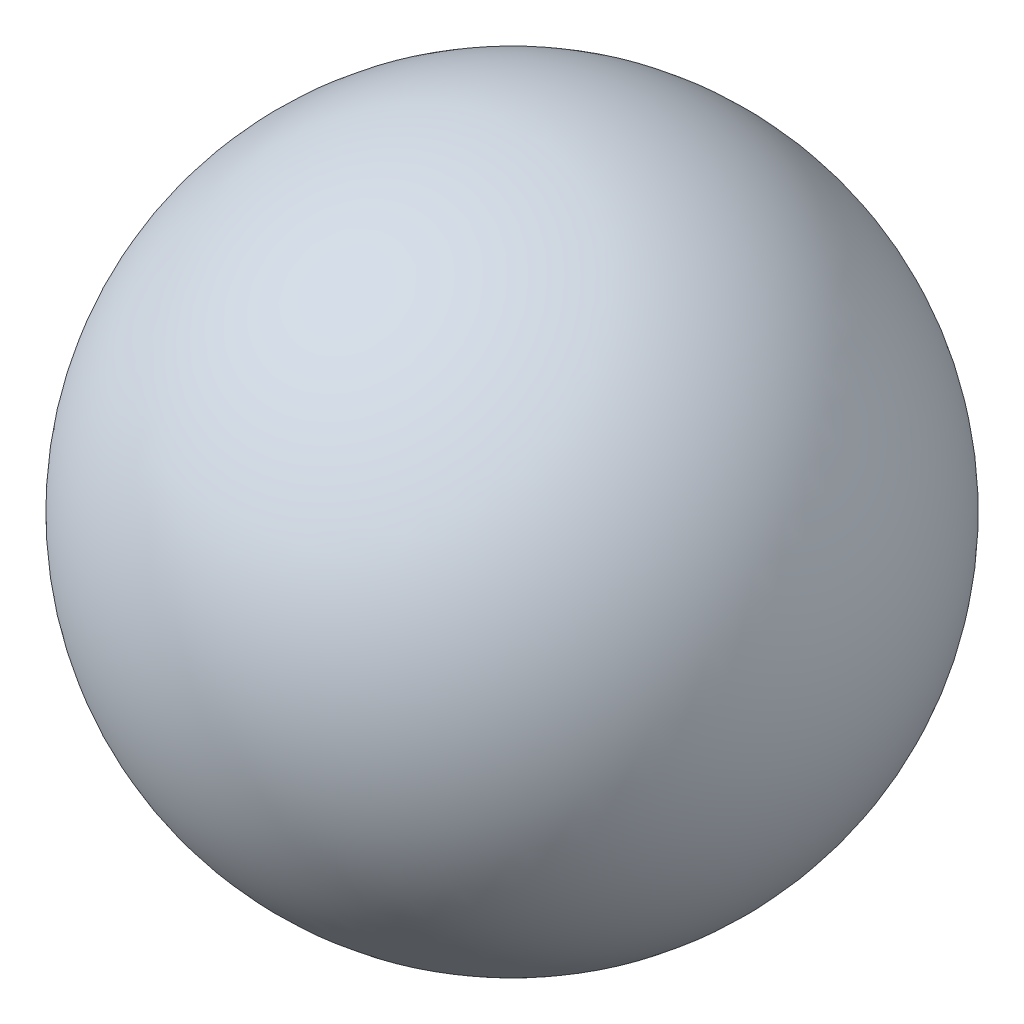
ISO-10303-21;
HEADER;
FILE_DESCRIPTION(('STEP AP214'),'2;1');
FILE_NAME('part.step','',(''),(''),'','','');
FILE_SCHEMA(('AUTOMOTIVE_DESIGN { 1 0 10303 214 1 1 1 1 }'));
ENDSEC;
DATA;
#1=APPLICATION_CONTEXT('core data for automotive mechanical design processes');
#2=APPLICATION_PROTOCOL_DEFINITION('international standard','automotive_design',2000,#1);
#3=PRODUCT_CONTEXT('',#1,'mechanical');
#4=PRODUCT('Part','Part','',(#3));
#5=PRODUCT_RELATED_PRODUCT_CATEGORY('part','',(#4));
#6=PRODUCT_DEFINITION_FORMATION('','',#4);
#7=PRODUCT_DEFINITION_CONTEXT('part definition',#1,'design');
#8=PRODUCT_DEFINITION('design','',#6,#7);
#9=PRODUCT_DEFINITION_SHAPE('','',#8);
#10=(LENGTH_UNIT() NAMED_UNIT(*) SI_UNIT(.MILLI.,.METRE.));
#11=(NAMED_UNIT(*) PLANE_ANGLE_UNIT() SI_UNIT($,.RADIAN.));
#12=(NAMED_UNIT(*) SI_UNIT($,.STERADIAN.) SOLID_ANGLE_UNIT());
#13=UNCERTAINTY_MEASURE_WITH_UNIT(LENGTH_MEASURE(1.E-05),#10,'distance_accuracy_value','');
#14=(GEOMETRIC_REPRESENTATION_CONTEXT(3) GLOBAL_UNCERTAINTY_ASSIGNED_CONTEXT((#13)) GLOBAL_UNIT_ASSIGNED_CONTEXT((#10,
#11,#12)) REPRESENTATION_CONTEXT('',''));
#15=CARTESIAN_POINT('',(0.,0.,0.));
#16=DIRECTION('',(0.,0.,1.));
#17=DIRECTION('',(1.,0.,0.));
#18=AXIS2_PLACEMENT_3D('',#15,#16,#17);
#19=CARTESIAN_POINT('',(0.,0.,0.));
#20=DIRECTION('',(0.,1.,0.));
#21=DIRECTION('',(1.,0.,0.));
#22=AXIS2_PLACEMENT_3D('',#19,#20,#21);
#23=SPHERICAL_SURFACE('',#22,11.);
#24=CARTESIAN_POINT('',(0.,11.,0.));
#25=VERTEX_POINT('',#24);
#26=VERTEX_LOOP('',#25);
#27=FACE_BOUND('',#26,.T.);
#28=ADVANCED_FACE('F29',(#27),#23,.T.);
#29=CLOSED_SHELL('',(#28));
#30=MANIFOLD_SOLID_BREP('B2',#29);
#31=ADVANCED_BREP_SHAPE_REPRESENTATION('',(#18,#30),#14);
#32=SHAPE_DEFINITION_REPRESENTATION(#9,#31);
ENDSEC;
END-ISO-10303-21;
